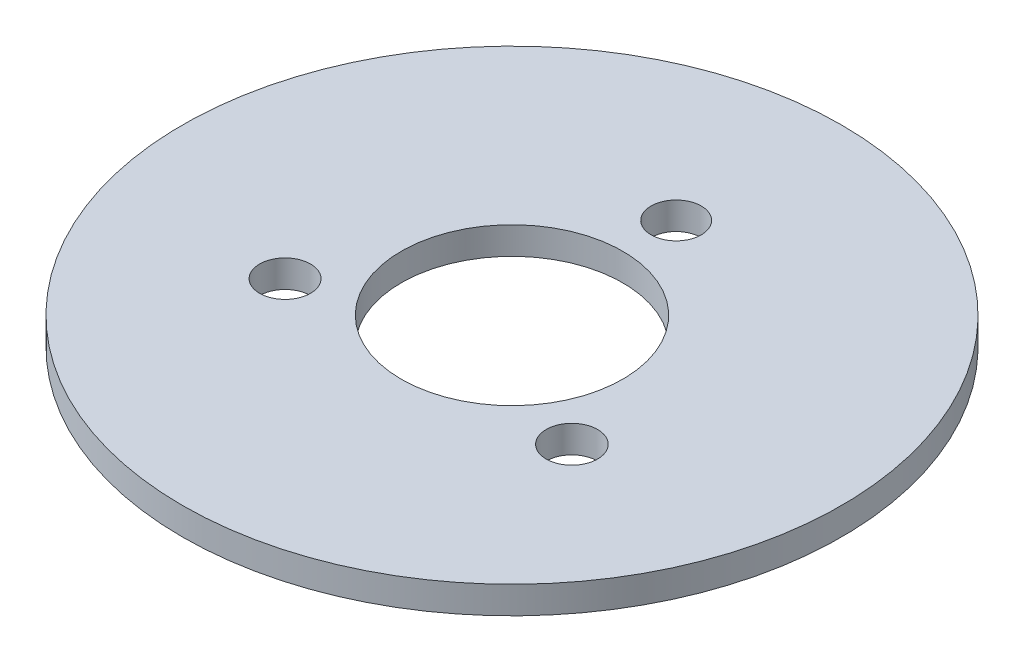
ISO-10303-21;
HEADER;
FILE_DESCRIPTION(('STEP AP214'),'2;1');
FILE_NAME('part.step','',(''),(''),'','','');
FILE_SCHEMA(('AUTOMOTIVE_DESIGN { 1 0 10303 214 1 1 1 1 }'));
ENDSEC;
DATA;
#1=APPLICATION_CONTEXT('core data for automotive mechanical design processes');
#2=APPLICATION_PROTOCOL_DEFINITION('international standard','automotive_design',2000,#1);
#3=PRODUCT_CONTEXT('',#1,'mechanical');
#4=PRODUCT('Part','Part','',(#3));
#5=PRODUCT_RELATED_PRODUCT_CATEGORY('part','',(#4));
#6=PRODUCT_DEFINITION_FORMATION('','',#4);
#7=PRODUCT_DEFINITION_CONTEXT('part definition',#1,'design');
#8=PRODUCT_DEFINITION('design','',#6,#7);
#9=PRODUCT_DEFINITION_SHAPE('','',#8);
#10=(LENGTH_UNIT() NAMED_UNIT(*) SI_UNIT(.MILLI.,.METRE.));
#11=(NAMED_UNIT(*) PLANE_ANGLE_UNIT() SI_UNIT($,.RADIAN.));
#12=(NAMED_UNIT(*) SI_UNIT($,.STERADIAN.) SOLID_ANGLE_UNIT());
#13=UNCERTAINTY_MEASURE_WITH_UNIT(LENGTH_MEASURE(1.E-05),#10,'distance_accuracy_value','');
#14=(GEOMETRIC_REPRESENTATION_CONTEXT(3) GLOBAL_UNCERTAINTY_ASSIGNED_CONTEXT((#13)) GLOBAL_UNIT_ASSIGNED_CONTEXT((#10,
#11,#12)) REPRESENTATION_CONTEXT('',''));
#15=CARTESIAN_POINT('',(0.,0.,0.));
#16=DIRECTION('',(0.,0.,1.));
#17=DIRECTION('',(1.,0.,0.));
#18=AXIS2_PLACEMENT_3D('',#15,#16,#17);
#19=CARTESIAN_POINT('',(0.,3.175,0.));
#20=DIRECTION('',(0.,-1.,0.));
#21=DIRECTION('',(0.,0.,-1.));
#22=AXIS2_PLACEMENT_3D('',#19,#20,#21);
#23=CYLINDRICAL_SURFACE('',#22,12.8604337973766);
#24=CARTESIAN_POINT('',(0.,3.175,0.));
#25=DIRECTION('',(0.,1.,0.));
#26=DIRECTION('',(0.,0.,1.));
#27=AXIS2_PLACEMENT_3D('',#24,#25,#26);
#28=CIRCLE('',#27,12.8604337973766);
#29=CARTESIAN_POINT('',(0.,3.175,12.8604337973766));
#30=VERTEX_POINT('',#29);
#31=EDGE_CURVE('E41',#30,#30,#28,.T.);
#32=ORIENTED_EDGE('',*,*,#31,.T.);
#33=EDGE_LOOP('',(#32));
#34=FACE_BOUND('',#33,.T.);
#35=CARTESIAN_POINT('',(0.,0.,0.));
#36=DIRECTION('',(0.,1.,0.));
#37=DIRECTION('',(0.,0.,1.));
#38=AXIS2_PLACEMENT_3D('',#35,#36,#37);
#39=CIRCLE('',#38,12.8604337973766);
#40=CARTESIAN_POINT('',(0.,0.,12.8604337973766));
#41=VERTEX_POINT('',#40);
#42=EDGE_CURVE('E58',#41,#41,#39,.T.);
#43=ORIENTED_EDGE('',*,*,#42,.F.);
#44=EDGE_LOOP('',(#43));
#45=FACE_BOUND('',#44,.T.);
#46=ADVANCED_FACE('F33',(#34,#45),#23,.F.);
#47=CARTESIAN_POINT('',(-16.8411707264414,3.175,9.49424536669134));
#48=DIRECTION('',(0.,-1.,0.));
#49=DIRECTION('',(0.,0.,-1.));
#50=AXIS2_PLACEMENT_3D('',#47,#48,#49);
#51=CYLINDRICAL_SURFACE('',#50,2.95288061806471);
#52=CARTESIAN_POINT('',(-16.8411707264414,3.175,9.49424536669134));
#53=DIRECTION('',(0.,1.,0.));
#54=DIRECTION('',(0.,0.,1.));
#55=AXIS2_PLACEMENT_3D('',#52,#53,#54);
#56=CIRCLE('',#55,2.95288061806471);
#57=CARTESIAN_POINT('',(-16.8411707264414,3.175,12.447125984756));
#58=VERTEX_POINT('',#57);
#59=EDGE_CURVE('E46',#58,#58,#56,.T.);
#60=ORIENTED_EDGE('',*,*,#59,.T.);
#61=EDGE_LOOP('',(#60));
#62=FACE_BOUND('',#61,.T.);
#63=CARTESIAN_POINT('',(-16.8411707264414,0.,9.49424536669134));
#64=DIRECTION('',(0.,1.,0.));
#65=DIRECTION('',(0.,0.,1.));
#66=AXIS2_PLACEMENT_3D('',#63,#64,#65);
#67=CIRCLE('',#66,2.95288061806471);
#68=CARTESIAN_POINT('',(-16.8411707264414,0.,12.447125984756));
#69=VERTEX_POINT('',#68);
#70=EDGE_CURVE('E56',#69,#69,#67,.T.);
#71=ORIENTED_EDGE('',*,*,#70,.F.);
#72=EDGE_LOOP('',(#71));
#73=FACE_BOUND('',#72,.T.);
#74=ADVANCED_FACE('F76',(#62,#73),#51,.F.);
#75=CARTESIAN_POINT('',(16.4445153546346,3.175,9.49424536669134));
#76=DIRECTION('',(0.,-1.,0.));
#77=DIRECTION('',(0.,0.,-1.));
#78=AXIS2_PLACEMENT_3D('',#75,#76,#77);
#79=CYLINDRICAL_SURFACE('',#78,2.97962175698696);
#80=CARTESIAN_POINT('',(16.4445153546346,3.175,9.49424536669134));
#81=DIRECTION('',(0.,1.,0.));
#82=DIRECTION('',(0.,0.,1.));
#83=AXIS2_PLACEMENT_3D('',#80,#81,#82);
#84=CIRCLE('',#83,2.97962175698696);
#85=CARTESIAN_POINT('',(16.4445153546346,3.175,12.4738671236783));
#86=VERTEX_POINT('',#85);
#87=EDGE_CURVE('E67',#86,#86,#84,.T.);
#88=ORIENTED_EDGE('',*,*,#87,.T.);
#89=EDGE_LOOP('',(#88));
#90=FACE_BOUND('',#89,.T.);
#91=CARTESIAN_POINT('',(16.4445153546346,0.,9.49424536669134));
#92=DIRECTION('',(0.,1.,0.));
#93=DIRECTION('',(0.,0.,1.));
#94=AXIS2_PLACEMENT_3D('',#91,#92,#93);
#95=CIRCLE('',#94,2.97962175698696);
#96=CARTESIAN_POINT('',(16.4445153546346,0.,12.4738671236783));
#97=VERTEX_POINT('',#96);
#98=EDGE_CURVE('E53',#97,#97,#95,.T.);
#99=ORIENTED_EDGE('',*,*,#98,.F.);
#100=EDGE_LOOP('',(#99));
#101=FACE_BOUND('',#100,.T.);
#102=ADVANCED_FACE('F94',(#90,#101),#79,.F.);
#103=CARTESIAN_POINT('',(0.,3.175,-19.05));
#104=DIRECTION('',(0.,-1.,0.));
#105=DIRECTION('',(0.,0.,-1.));
#106=AXIS2_PLACEMENT_3D('',#103,#104,#105);
#107=CYLINDRICAL_SURFACE('',#106,2.90910213730794);
#108=CARTESIAN_POINT('',(0.,3.175,-19.05));
#109=DIRECTION('',(0.,1.,0.));
#110=DIRECTION('',(0.,0.,1.));
#111=AXIS2_PLACEMENT_3D('',#108,#109,#110);
#112=CIRCLE('',#111,2.90910213730794);
#113=CARTESIAN_POINT('',(0.,3.175,-16.1408978626921));
#114=VERTEX_POINT('',#113);
#115=EDGE_CURVE('E63',#114,#114,#112,.T.);
#116=ORIENTED_EDGE('',*,*,#115,.T.);
#117=EDGE_LOOP('',(#116));
#118=FACE_BOUND('',#117,.T.);
#119=CARTESIAN_POINT('',(0.,0.,-19.05));
#120=DIRECTION('',(0.,1.,0.));
#121=DIRECTION('',(0.,0.,1.));
#122=AXIS2_PLACEMENT_3D('',#119,#120,#121);
#123=CIRCLE('',#122,2.90910213730794);
#124=CARTESIAN_POINT('',(0.,0.,-16.1408978626921));
#125=VERTEX_POINT('',#124);
#126=EDGE_CURVE('E50',#125,#125,#123,.T.);
#127=ORIENTED_EDGE('',*,*,#126,.F.);
#128=EDGE_LOOP('',(#127));
#129=FACE_BOUND('',#128,.T.);
#130=ADVANCED_FACE('F35',(#118,#129),#107,.F.);
#131=CARTESIAN_POINT('',(0.,3.175,0.));
#132=DIRECTION('',(0.,-1.,0.));
#133=DIRECTION('',(0.,0.,-1.));
#134=AXIS2_PLACEMENT_3D('',#131,#132,#133);
#135=CYLINDRICAL_SURFACE('',#134,38.2438751150373);
#136=CARTESIAN_POINT('',(0.,3.175,0.));
#137=DIRECTION('',(0.,1.,0.));
#138=DIRECTION('',(0.,0.,1.));
#139=AXIS2_PLACEMENT_3D('',#136,#137,#138);
#140=CIRCLE('',#139,38.2438751150373);
#141=CARTESIAN_POINT('',(0.,3.175,38.2438751150373));
#142=VERTEX_POINT('',#141);
#143=EDGE_CURVE('E10',#142,#142,#140,.T.);
#144=ORIENTED_EDGE('',*,*,#143,.F.);
#145=EDGE_LOOP('',(#144));
#146=FACE_BOUND('',#145,.T.);
#147=CARTESIAN_POINT('',(0.,0.,0.));
#148=DIRECTION('',(0.,1.,0.));
#149=DIRECTION('',(0.,0.,1.));
#150=AXIS2_PLACEMENT_3D('',#147,#148,#149);
#151=CIRCLE('',#150,38.2438751150373);
#152=CARTESIAN_POINT('',(0.,0.,38.2438751150373));
#153=VERTEX_POINT('',#152);
#154=EDGE_CURVE('E37',#153,#153,#151,.T.);
#155=ORIENTED_EDGE('',*,*,#154,.T.);
#156=EDGE_LOOP('',(#155));
#157=FACE_BOUND('',#156,.T.);
#158=ADVANCED_FACE('F83',(#146,#157),#135,.T.);
#159=CARTESIAN_POINT('',(0.,3.175,0.));
#160=DIRECTION('',(0.,1.,0.));
#161=DIRECTION('',(0.,0.,1.));
#162=AXIS2_PLACEMENT_3D('',#159,#160,#161);
#163=PLANE('',#162);
#164=ORIENTED_EDGE('',*,*,#115,.F.);
#165=EDGE_LOOP('',(#164));
#166=FACE_BOUND('',#165,.T.);
#167=ORIENTED_EDGE('',*,*,#87,.F.);
#168=EDGE_LOOP('',(#167));
#169=FACE_BOUND('',#168,.T.);
#170=ORIENTED_EDGE('',*,*,#59,.F.);
#171=EDGE_LOOP('',(#170));
#172=FACE_BOUND('',#171,.T.);
#173=ORIENTED_EDGE('',*,*,#31,.F.);
#174=EDGE_LOOP('',(#173));
#175=FACE_BOUND('',#174,.T.);
#176=ORIENTED_EDGE('',*,*,#143,.T.);
#177=EDGE_LOOP('',(#176));
#178=FACE_BOUND('',#177,.T.);
#179=ADVANCED_FACE('F79',(#166,#169,#172,#175,#178),#163,.T.);
#180=CARTESIAN_POINT('',(0.,0.,0.));
#181=DIRECTION('',(0.,1.,0.));
#182=DIRECTION('',(0.,0.,1.));
#183=AXIS2_PLACEMENT_3D('',#180,#181,#182);
#184=PLANE('',#183);
#185=ORIENTED_EDGE('',*,*,#126,.T.);
#186=EDGE_LOOP('',(#185));
#187=FACE_BOUND('',#186,.T.);
#188=ORIENTED_EDGE('',*,*,#98,.T.);
#189=EDGE_LOOP('',(#188));
#190=FACE_BOUND('',#189,.T.);
#191=ORIENTED_EDGE('',*,*,#70,.T.);
#192=EDGE_LOOP('',(#191));
#193=FACE_BOUND('',#192,.T.);
#194=ORIENTED_EDGE('',*,*,#42,.T.);
#195=EDGE_LOOP('',(#194));
#196=FACE_BOUND('',#195,.T.);
#197=ORIENTED_EDGE('',*,*,#154,.F.);
#198=EDGE_LOOP('',(#197));
#199=FACE_BOUND('',#198,.T.);
#200=ADVANCED_FACE('F82',(#187,#190,#193,#196,#199),#184,.F.);
#201=CLOSED_SHELL('',(#46,#74,#102,#130,#158,#179,#200));
#202=MANIFOLD_SOLID_BREP('B2',#201);
#203=ADVANCED_BREP_SHAPE_REPRESENTATION('',(#18,#202),#14);
#204=SHAPE_DEFINITION_REPRESENTATION(#9,#203);
ENDSEC;
END-ISO-10303-21;
